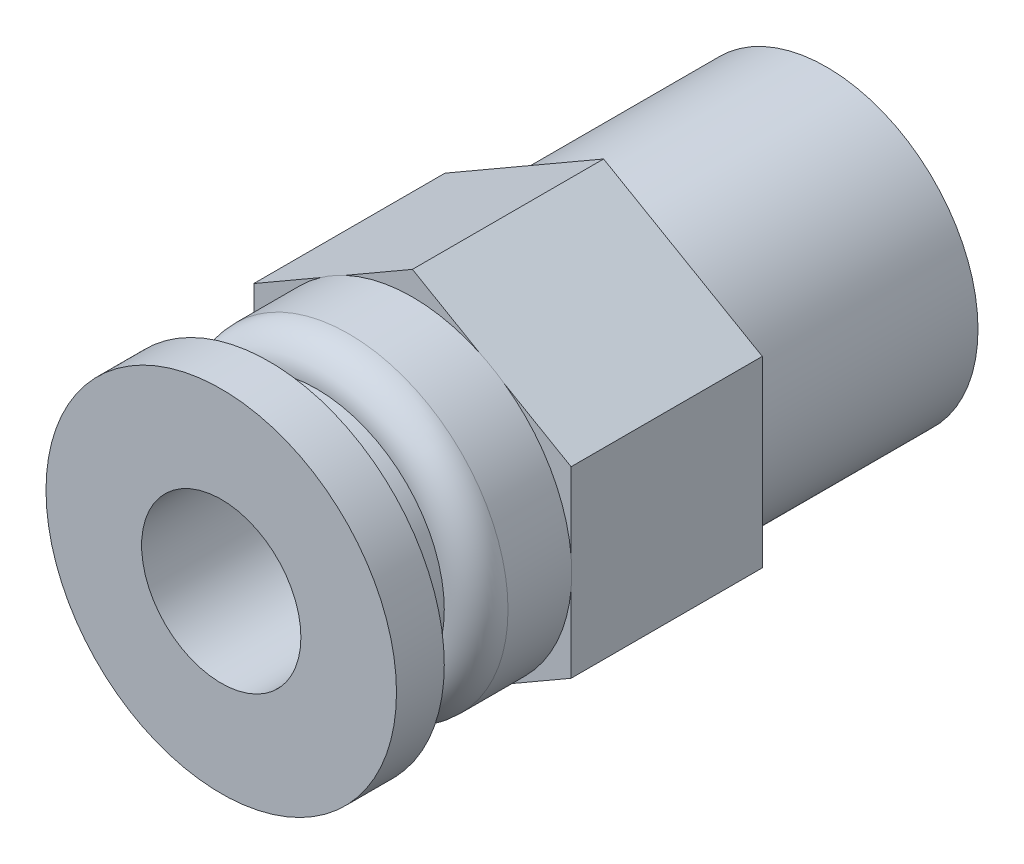
ISO-10303-21;
HEADER;
FILE_DESCRIPTION(('STEP AP214'),'2;1');
FILE_NAME('part.step','',(''),(''),'','','');
FILE_SCHEMA(('AUTOMOTIVE_DESIGN { 1 0 10303 214 1 1 1 1 }'));
ENDSEC;
DATA;
#1=APPLICATION_CONTEXT('core data for automotive mechanical design processes');
#2=APPLICATION_PROTOCOL_DEFINITION('international standard','automotive_design',2000,#1);
#3=PRODUCT_CONTEXT('',#1,'mechanical');
#4=PRODUCT('Part','Part','',(#3));
#5=PRODUCT_RELATED_PRODUCT_CATEGORY('part','',(#4));
#6=PRODUCT_DEFINITION_FORMATION('','',#4);
#7=PRODUCT_DEFINITION_CONTEXT('part definition',#1,'design');
#8=PRODUCT_DEFINITION('design','',#6,#7);
#9=PRODUCT_DEFINITION_SHAPE('','',#8);
#10=(LENGTH_UNIT() NAMED_UNIT(*) SI_UNIT(.MILLI.,.METRE.));
#11=(NAMED_UNIT(*) PLANE_ANGLE_UNIT() SI_UNIT($,.RADIAN.));
#12=(NAMED_UNIT(*) SI_UNIT($,.STERADIAN.) SOLID_ANGLE_UNIT());
#13=UNCERTAINTY_MEASURE_WITH_UNIT(LENGTH_MEASURE(1.E-05),#10,'distance_accuracy_value','');
#14=(GEOMETRIC_REPRESENTATION_CONTEXT(3) GLOBAL_UNCERTAINTY_ASSIGNED_CONTEXT((#13)) GLOBAL_UNIT_ASSIGNED_CONTEXT((#10,
#11,#12)) REPRESENTATION_CONTEXT('',''));
#15=CARTESIAN_POINT('',(0.,0.,0.));
#16=DIRECTION('',(0.,0.,1.));
#17=DIRECTION('',(1.,0.,0.));
#18=AXIS2_PLACEMENT_3D('',#15,#16,#17);
#19=CARTESIAN_POINT('',(0.,0.,7.));
#20=DIRECTION('',(0.,0.,1.));
#21=DIRECTION('',(1.,0.,0.));
#22=AXIS2_PLACEMENT_3D('',#19,#20,#21);
#23=PLANE('',#22);
#24=DIRECTION('',(-0.866025403784439,0.5,0.));
#25=VECTOR('',#24,1.);
#26=CARTESIAN_POINT('',(1.29903810567666,0.750000000000001,7.));
#27=LINE('',#26,#25);
#28=CARTESIAN_POINT('',(1.29903810567666,0.750000000000001,7.));
#29=VERTEX_POINT('',#28);
#30=CARTESIAN_POINT('',(0.,1.5,7.));
#31=VERTEX_POINT('',#30);
#32=EDGE_CURVE('E307',#29,#31,#27,.T.);
#33=ORIENTED_EDGE('',*,*,#32,.F.);
#34=CARTESIAN_POINT('',(0.,0.,7.));
#35=DIRECTION('',(0.,0.,1.));
#36=DIRECTION('',(1.,0.,0.));
#37=AXIS2_PLACEMENT_3D('',#34,#35,#36);
#38=CIRCLE('',#37,1.5);
#39=EDGE_CURVE('E48',#29,#31,#38,.T.);
#40=ORIENTED_EDGE('',*,*,#39,.T.);
#41=EDGE_LOOP('',(#33,#40));
#42=FACE_BOUND('',#41,.T.);
#43=ADVANCED_FACE('F39',(#42),#23,.T.);
#44=DIRECTION('',(-0.866025403784439,-0.5,0.));
#45=VECTOR('',#44,1.);
#46=CARTESIAN_POINT('',(0.,1.5,7.));
#47=LINE('',#46,#45);
#48=CARTESIAN_POINT('',(-1.29903810567666,0.75,7.));
#49=VERTEX_POINT('',#48);
#50=EDGE_CURVE('E311',#31,#49,#47,.T.);
#51=ORIENTED_EDGE('',*,*,#50,.F.);
#52=CARTESIAN_POINT('',(0.,0.,7.));
#53=DIRECTION('',(0.,0.,1.));
#54=DIRECTION('',(1.,0.,0.));
#55=AXIS2_PLACEMENT_3D('',#52,#53,#54);
#56=CIRCLE('',#55,1.5);
#57=EDGE_CURVE('E392',#31,#49,#56,.T.);
#58=ORIENTED_EDGE('',*,*,#57,.T.);
#59=EDGE_LOOP('',(#51,#58));
#60=FACE_BOUND('',#59,.T.);
#61=ADVANCED_FACE('F410',(#60),#23,.T.);
#62=DIRECTION('',(0.,-1.,0.));
#63=VECTOR('',#62,1.);
#64=CARTESIAN_POINT('',(-1.29903810567666,0.75,7.));
#65=LINE('',#64,#63);
#66=CARTESIAN_POINT('',(-1.29903810567666,-0.750000000000001,7.));
#67=VERTEX_POINT('',#66);
#68=EDGE_CURVE('E316',#49,#67,#65,.T.);
#69=ORIENTED_EDGE('',*,*,#68,.F.);
#70=CARTESIAN_POINT('',(0.,0.,7.));
#71=DIRECTION('',(0.,0.,1.));
#72=DIRECTION('',(1.,0.,0.));
#73=AXIS2_PLACEMENT_3D('',#70,#71,#72);
#74=CIRCLE('',#73,1.5);
#75=EDGE_CURVE('E389',#49,#67,#74,.T.);
#76=ORIENTED_EDGE('',*,*,#75,.T.);
#77=EDGE_LOOP('',(#69,#76));
#78=FACE_BOUND('',#77,.T.);
#79=ADVANCED_FACE('F416',(#78),#23,.T.);
#80=DIRECTION('',(0.866025403784439,-0.5,0.));
#81=VECTOR('',#80,1.);
#82=CARTESIAN_POINT('',(-1.29903810567666,-0.750000000000001,7.));
#83=LINE('',#82,#81);
#84=CARTESIAN_POINT('',(0.,-1.5,7.));
#85=VERTEX_POINT('',#84);
#86=EDGE_CURVE('E320',#67,#85,#83,.T.);
#87=ORIENTED_EDGE('',*,*,#86,.F.);
#88=CARTESIAN_POINT('',(0.,0.,7.));
#89=DIRECTION('',(0.,0.,1.));
#90=DIRECTION('',(1.,0.,0.));
#91=AXIS2_PLACEMENT_3D('',#88,#89,#90);
#92=CIRCLE('',#91,1.5);
#93=EDGE_CURVE('E386',#67,#85,#92,.T.);
#94=ORIENTED_EDGE('',*,*,#93,.T.);
#95=EDGE_LOOP('',(#87,#94));
#96=FACE_BOUND('',#95,.T.);
#97=ADVANCED_FACE('F427',(#96),#23,.T.);
#98=DIRECTION('',(0.866025403784439,0.5,0.));
#99=VECTOR('',#98,1.);
#100=CARTESIAN_POINT('',(0.,-1.5,7.));
#101=LINE('',#100,#99);
#102=CARTESIAN_POINT('',(1.29903810567666,-0.75,7.));
#103=VERTEX_POINT('',#102);
#104=EDGE_CURVE('E324',#85,#103,#101,.T.);
#105=ORIENTED_EDGE('',*,*,#104,.F.);
#106=CARTESIAN_POINT('',(0.,0.,7.));
#107=DIRECTION('',(0.,0.,1.));
#108=DIRECTION('',(1.,0.,0.));
#109=AXIS2_PLACEMENT_3D('',#106,#107,#108);
#110=CIRCLE('',#109,1.5);
#111=EDGE_CURVE('E383',#85,#103,#110,.T.);
#112=ORIENTED_EDGE('',*,*,#111,.T.);
#113=EDGE_LOOP('',(#105,#112));
#114=FACE_BOUND('',#113,.T.);
#115=ADVANCED_FACE('F429',(#114),#23,.T.);
#116=CARTESIAN_POINT('',(0.,0.,13.));
#117=DIRECTION('',(0.,0.,1.));
#118=DIRECTION('',(1.,0.,0.));
#119=AXIS2_PLACEMENT_3D('',#116,#117,#118);
#120=PLANE('',#119);
#121=CARTESIAN_POINT('',(0.,0.,13.));
#122=DIRECTION('',(0.,0.,1.));
#123=DIRECTION('',(1.,0.,0.));
#124=AXIS2_PLACEMENT_3D('',#121,#122,#123);
#125=CIRCLE('',#124,5.);
#126=CARTESIAN_POINT('',(4.97964607176052,0.450693909433034,13.));
#127=VERTEX_POINT('',#126);
#128=CARTESIAN_POINT('',(2.88013541078014,4.08715304528352,13.));
#129=VERTEX_POINT('',#128);
#130=EDGE_CURVE('E55',#127,#129,#125,.T.);
#131=ORIENTED_EDGE('',*,*,#130,.F.);
#132=DIRECTION('',(0.,1.,0.));
#133=VECTOR('',#132,1.);
#134=CARTESIAN_POINT('',(4.97964607176052,-2.875,13.));
#135=LINE('',#134,#133);
#136=CARTESIAN_POINT('',(4.97964607176052,2.875,13.));
#137=VERTEX_POINT('',#136);
#138=EDGE_CURVE('E175',#127,#137,#135,.T.);
#139=ORIENTED_EDGE('',*,*,#138,.T.);
#140=DIRECTION('',(-0.866025403784439,0.5,0.));
#141=VECTOR('',#140,1.);
#142=CARTESIAN_POINT('',(4.97964607176052,2.875,13.));
#143=LINE('',#142,#141);
#144=EDGE_CURVE('E565',#137,#129,#143,.T.);
#145=ORIENTED_EDGE('',*,*,#144,.T.);
#146=EDGE_LOOP('',(#131,#139,#145));
#147=FACE_BOUND('',#146,.T.);
#148=ADVANCED_FACE('F435',(#147),#120,.T.);
#149=CARTESIAN_POINT('',(2.09951066098038,4.53784695471649,13.));
#150=VERTEX_POINT('',#149);
#151=CARTESIAN_POINT('',(-2.09951066098038,4.53784695471649,13.));
#152=VERTEX_POINT('',#151);
#153=EDGE_CURVE('E215',#150,#152,#125,.T.);
#154=ORIENTED_EDGE('',*,*,#153,.F.);
#155=CARTESIAN_POINT('',(0.,5.75,13.));
#156=VERTEX_POINT('',#155);
#157=EDGE_CURVE('E285',#150,#156,#143,.T.);
#158=ORIENTED_EDGE('',*,*,#157,.T.);
#159=DIRECTION('',(-0.866025403784439,-0.5,0.));
#160=VECTOR('',#159,1.);
#161=CARTESIAN_POINT('',(0.,5.75,13.));
#162=LINE('',#161,#160);
#163=EDGE_CURVE('E253',#156,#152,#162,.T.);
#164=ORIENTED_EDGE('',*,*,#163,.T.);
#165=EDGE_LOOP('',(#154,#158,#164));
#166=FACE_BOUND('',#165,.T.);
#167=ADVANCED_FACE('F572',(#166),#120,.T.);
#168=CARTESIAN_POINT('',(-2.88013541078015,4.08715304528351,13.));
#169=VERTEX_POINT('',#168);
#170=CARTESIAN_POINT('',(-4.97964607176052,0.450693909432992,13.));
#171=VERTEX_POINT('',#170);
#172=EDGE_CURVE('E223',#169,#171,#125,.T.);
#173=ORIENTED_EDGE('',*,*,#172,.F.);
#174=CARTESIAN_POINT('',(-4.97964607176052,2.875,13.));
#175=VERTEX_POINT('',#174);
#176=EDGE_CURVE('E562',#169,#175,#162,.T.);
#177=ORIENTED_EDGE('',*,*,#176,.T.);
#178=DIRECTION('',(0.,-1.,0.));
#179=VECTOR('',#178,1.);
#180=CARTESIAN_POINT('',(-4.97964607176052,2.875,13.));
#181=LINE('',#180,#179);
#182=EDGE_CURVE('E255',#175,#171,#181,.T.);
#183=ORIENTED_EDGE('',*,*,#182,.T.);
#184=EDGE_LOOP('',(#173,#177,#183));
#185=FACE_BOUND('',#184,.T.);
#186=ADVANCED_FACE('F818',(#185),#120,.T.);
#187=CARTESIAN_POINT('',(-4.97964607176052,-0.450693909432997,13.));
#188=VERTEX_POINT('',#187);
#189=CARTESIAN_POINT('',(-2.88013541078016,-4.0871530452835,13.));
#190=VERTEX_POINT('',#189);
#191=EDGE_CURVE('E199',#188,#190,#125,.T.);
#192=ORIENTED_EDGE('',*,*,#191,.F.);
#193=CARTESIAN_POINT('',(-4.97964607176052,-2.875,13.));
#194=VERTEX_POINT('',#193);
#195=EDGE_CURVE('E240',#188,#194,#181,.T.);
#196=ORIENTED_EDGE('',*,*,#195,.T.);
#197=DIRECTION('',(0.866025403784439,-0.5,0.));
#198=VECTOR('',#197,1.);
#199=CARTESIAN_POINT('',(-4.97964607176052,-2.875,13.));
#200=LINE('',#199,#198);
#201=EDGE_CURVE('E243',#194,#190,#200,.T.);
#202=ORIENTED_EDGE('',*,*,#201,.T.);
#203=EDGE_LOOP('',(#192,#196,#202));
#204=FACE_BOUND('',#203,.T.);
#205=ADVANCED_FACE('F239',(#204),#120,.T.);
#206=CARTESIAN_POINT('',(-2.09951066098036,-4.5378469547165,13.));
#207=VERTEX_POINT('',#206);
#208=CARTESIAN_POINT('',(2.09951066098037,-4.5378469547165,13.));
#209=VERTEX_POINT('',#208);
#210=EDGE_CURVE('E195',#207,#209,#125,.T.);
#211=ORIENTED_EDGE('',*,*,#210,.F.);
#212=CARTESIAN_POINT('',(0.,-5.75,13.));
#213=VERTEX_POINT('',#212);
#214=EDGE_CURVE('E260',#207,#213,#200,.T.);
#215=ORIENTED_EDGE('',*,*,#214,.T.);
#216=DIRECTION('',(0.866025403784439,0.5,0.));
#217=VECTOR('',#216,1.);
#218=CARTESIAN_POINT('',(0.,-5.75,13.));
#219=LINE('',#218,#217);
#220=EDGE_CURVE('E266',#213,#209,#219,.T.);
#221=ORIENTED_EDGE('',*,*,#220,.T.);
#222=EDGE_LOOP('',(#211,#215,#221));
#223=FACE_BOUND('',#222,.T.);
#224=ADVANCED_FACE('F446',(#223),#120,.T.);
#225=DIRECTION('',(0.,1.,0.));
#226=VECTOR('',#225,1.);
#227=CARTESIAN_POINT('',(1.29903810567666,-0.75,7.));
#228=LINE('',#227,#226);
#229=EDGE_CURVE('E328',#103,#29,#228,.T.);
#230=ORIENTED_EDGE('',*,*,#229,.F.);
#231=CARTESIAN_POINT('',(0.,0.,7.));
#232=DIRECTION('',(0.,0.,1.));
#233=DIRECTION('',(1.,0.,0.));
#234=AXIS2_PLACEMENT_3D('',#231,#232,#233);
#235=CIRCLE('',#234,1.5);
#236=EDGE_CURVE('E380',#103,#29,#235,.T.);
#237=ORIENTED_EDGE('',*,*,#236,.T.);
#238=EDGE_LOOP('',(#230,#237));
#239=FACE_BOUND('',#238,.T.);
#240=ADVANCED_FACE('F437',(#239),#23,.T.);
#241=CARTESIAN_POINT('',(0.,0.,0.));
#242=DIRECTION('',(0.,0.,1.));
#243=DIRECTION('',(1.,0.,0.));
#244=AXIS2_PLACEMENT_3D('',#241,#242,#243);
#245=PLANE('',#244);
#246=CARTESIAN_POINT('',(0.,0.,0.));
#247=DIRECTION('',(0.,0.,1.));
#248=DIRECTION('',(1.,0.,0.));
#249=AXIS2_PLACEMENT_3D('',#246,#247,#248);
#250=CIRCLE('',#249,4.75);
#251=CARTESIAN_POINT('',(4.75,0.,0.));
#252=VERTEX_POINT('',#251);
#253=EDGE_CURVE('E201',#252,#252,#250,.T.);
#254=ORIENTED_EDGE('',*,*,#253,.F.);
#255=EDGE_LOOP('',(#254));
#256=FACE_BOUND('',#255,.T.);
#257=DIRECTION('',(-0.866025403784439,0.5,0.));
#258=VECTOR('',#257,1.);
#259=CARTESIAN_POINT('',(1.29903810567666,0.750000000000001,0.));
#260=LINE('',#259,#258);
#261=CARTESIAN_POINT('',(1.29903810567666,0.750000000000001,0.));
#262=VERTEX_POINT('',#261);
#263=CARTESIAN_POINT('',(0.,1.5,0.));
#264=VERTEX_POINT('',#263);
#265=EDGE_CURVE('E306',#262,#264,#260,.T.);
#266=ORIENTED_EDGE('',*,*,#265,.T.);
#267=DIRECTION('',(-0.866025403784439,-0.5,0.));
#268=VECTOR('',#267,1.);
#269=CARTESIAN_POINT('',(0.,1.5,0.));
#270=LINE('',#269,#268);
#271=CARTESIAN_POINT('',(-1.29903810567666,0.75,0.));
#272=VERTEX_POINT('',#271);
#273=EDGE_CURVE('E336',#264,#272,#270,.T.);
#274=ORIENTED_EDGE('',*,*,#273,.T.);
#275=DIRECTION('',(0.,-1.,0.));
#276=VECTOR('',#275,1.);
#277=CARTESIAN_POINT('',(-1.29903810567666,0.75,0.));
#278=LINE('',#277,#276);
#279=CARTESIAN_POINT('',(-1.29903810567666,-0.750000000000001,0.));
#280=VERTEX_POINT('',#279);
#281=EDGE_CURVE('E340',#272,#280,#278,.T.);
#282=ORIENTED_EDGE('',*,*,#281,.T.);
#283=DIRECTION('',(0.866025403784439,-0.5,0.));
#284=VECTOR('',#283,1.);
#285=CARTESIAN_POINT('',(-1.29903810567666,-0.750000000000001,0.));
#286=LINE('',#285,#284);
#287=CARTESIAN_POINT('',(0.,-1.5,0.));
#288=VERTEX_POINT('',#287);
#289=EDGE_CURVE('E344',#280,#288,#286,.T.);
#290=ORIENTED_EDGE('',*,*,#289,.T.);
#291=DIRECTION('',(0.866025403784439,0.5,0.));
#292=VECTOR('',#291,1.);
#293=CARTESIAN_POINT('',(0.,-1.5,0.));
#294=LINE('',#293,#292);
#295=CARTESIAN_POINT('',(1.29903810567666,-0.75,0.));
#296=VERTEX_POINT('',#295);
#297=EDGE_CURVE('E348',#288,#296,#294,.T.);
#298=ORIENTED_EDGE('',*,*,#297,.T.);
#299=DIRECTION('',(0.,1.,0.));
#300=VECTOR('',#299,1.);
#301=CARTESIAN_POINT('',(1.29903810567666,-0.75,0.));
#302=LINE('',#301,#300);
#303=EDGE_CURVE('E312',#296,#262,#302,.T.);
#304=ORIENTED_EDGE('',*,*,#303,.T.);
#305=EDGE_LOOP('',(#266,#274,#282,#290,#298,#304));
#306=FACE_BOUND('',#305,.T.);
#307=ADVANCED_FACE('F445',(#256,#306),#245,.F.);
#308=CARTESIAN_POINT('',(0.,0.,7.));
#309=DIRECTION('',(0.,0.,-1.));
#310=DIRECTION('',(-1.,0.,0.));
#311=AXIS2_PLACEMENT_3D('',#308,#309,#310);
#312=CYLINDRICAL_SURFACE('',#311,4.75);
#313=CARTESIAN_POINT('',(0.,0.,7.));
#314=DIRECTION('',(0.,0.,1.));
#315=DIRECTION('',(1.,0.,0.));
#316=AXIS2_PLACEMENT_3D('',#313,#314,#315);
#317=CIRCLE('',#316,4.75);
#318=CARTESIAN_POINT('',(4.75,0.,7.));
#319=VERTEX_POINT('',#318);
#320=EDGE_CURVE('E196',#319,#319,#317,.T.);
#321=ORIENTED_EDGE('',*,*,#320,.F.);
#322=EDGE_LOOP('',(#321));
#323=FACE_BOUND('',#322,.T.);
#324=ORIENTED_EDGE('',*,*,#253,.T.);
#325=EDGE_LOOP('',(#324));
#326=FACE_BOUND('',#325,.T.);
#327=ADVANCED_FACE('F452',(#323,#326),#312,.T.);
#328=CARTESIAN_POINT('',(1.29903810567666,0.750000000000001,7.));
#329=DIRECTION('',(-0.5,-0.866025403784439,0.));
#330=DIRECTION('',(0.866025403784439,-0.5,0.));
#331=AXIS2_PLACEMENT_3D('',#328,#329,#330);
#332=PLANE('',#331);
#333=ORIENTED_EDGE('',*,*,#265,.F.);
#334=DIRECTION('',(0.,0.,-1.));
#335=VECTOR('',#334,1.);
#336=CARTESIAN_POINT('',(1.29903810567666,0.750000000000001,7.));
#337=LINE('',#336,#335);
#338=EDGE_CURVE('E332',#29,#262,#337,.T.);
#339=ORIENTED_EDGE('',*,*,#338,.F.);
#340=ORIENTED_EDGE('',*,*,#32,.T.);
#341=DIRECTION('',(0.,0.,-1.));
#342=VECTOR('',#341,1.);
#343=CARTESIAN_POINT('',(0.,1.5,7.));
#344=LINE('',#343,#342);
#345=EDGE_CURVE('E370',#31,#264,#344,.T.);
#346=ORIENTED_EDGE('',*,*,#345,.T.);
#347=EDGE_LOOP('',(#333,#339,#340,#346));
#348=FACE_BOUND('',#347,.T.);
#349=ADVANCED_FACE('F404',(#348),#332,.T.);
#350=CARTESIAN_POINT('',(0.,1.5,7.));
#351=DIRECTION('',(0.5,-0.866025403784439,0.));
#352=DIRECTION('',(0.866025403784439,0.5,0.));
#353=AXIS2_PLACEMENT_3D('',#350,#351,#352);
#354=PLANE('',#353);
#355=ORIENTED_EDGE('',*,*,#273,.F.);
#356=ORIENTED_EDGE('',*,*,#345,.F.);
#357=ORIENTED_EDGE('',*,*,#50,.T.);
#358=DIRECTION('',(0.,0.,-1.));
#359=VECTOR('',#358,1.);
#360=CARTESIAN_POINT('',(-1.29903810567666,0.75,7.));
#361=LINE('',#360,#359);
#362=EDGE_CURVE('E367',#49,#272,#361,.T.);
#363=ORIENTED_EDGE('',*,*,#362,.T.);
#364=EDGE_LOOP('',(#355,#356,#357,#363));
#365=FACE_BOUND('',#364,.T.);
#366=ADVANCED_FACE('F407',(#365),#354,.T.);
#367=CARTESIAN_POINT('',(-1.29903810567666,0.75,7.));
#368=DIRECTION('',(1.,0.,0.));
#369=DIRECTION('',(0.,1.,0.));
#370=AXIS2_PLACEMENT_3D('',#367,#368,#369);
#371=PLANE('',#370);
#372=ORIENTED_EDGE('',*,*,#281,.F.);
#373=ORIENTED_EDGE('',*,*,#362,.F.);
#374=ORIENTED_EDGE('',*,*,#68,.T.);
#375=DIRECTION('',(0.,0.,-1.));
#376=VECTOR('',#375,1.);
#377=CARTESIAN_POINT('',(-1.29903810567666,-0.750000000000001,7.));
#378=LINE('',#377,#376);
#379=EDGE_CURVE('E364',#67,#280,#378,.T.);
#380=ORIENTED_EDGE('',*,*,#379,.T.);
#381=EDGE_LOOP('',(#372,#373,#374,#380));
#382=FACE_BOUND('',#381,.T.);
#383=ADVANCED_FACE('F420',(#382),#371,.T.);
#384=CARTESIAN_POINT('',(-1.29903810567666,-0.750000000000001,7.));
#385=DIRECTION('',(0.5,0.866025403784439,0.));
#386=DIRECTION('',(-0.866025403784439,0.5,0.));
#387=AXIS2_PLACEMENT_3D('',#384,#385,#386);
#388=PLANE('',#387);
#389=ORIENTED_EDGE('',*,*,#289,.F.);
#390=ORIENTED_EDGE('',*,*,#379,.F.);
#391=ORIENTED_EDGE('',*,*,#86,.T.);
#392=DIRECTION('',(0.,0.,-1.));
#393=VECTOR('',#392,1.);
#394=CARTESIAN_POINT('',(0.,-1.5,7.));
#395=LINE('',#394,#393);
#396=EDGE_CURVE('E361',#85,#288,#395,.T.);
#397=ORIENTED_EDGE('',*,*,#396,.T.);
#398=EDGE_LOOP('',(#389,#390,#391,#397));
#399=FACE_BOUND('',#398,.T.);
#400=ADVANCED_FACE('F424',(#399),#388,.T.);
#401=CARTESIAN_POINT('',(0.,-1.5,7.));
#402=DIRECTION('',(-0.5,0.866025403784439,0.));
#403=DIRECTION('',(-0.866025403784439,-0.5,0.));
#404=AXIS2_PLACEMENT_3D('',#401,#402,#403);
#405=PLANE('',#404);
#406=ORIENTED_EDGE('',*,*,#297,.F.);
#407=ORIENTED_EDGE('',*,*,#396,.F.);
#408=ORIENTED_EDGE('',*,*,#104,.T.);
#409=DIRECTION('',(0.,0.,-1.));
#410=VECTOR('',#409,1.);
#411=CARTESIAN_POINT('',(1.29903810567666,-0.75,7.));
#412=LINE('',#411,#410);
#413=EDGE_CURVE('E358',#103,#296,#412,.T.);
#414=ORIENTED_EDGE('',*,*,#413,.T.);
#415=EDGE_LOOP('',(#406,#407,#408,#414));
#416=FACE_BOUND('',#415,.T.);
#417=ADVANCED_FACE('F464',(#416),#405,.T.);
#418=CARTESIAN_POINT('',(1.29903810567666,-0.75,7.));
#419=DIRECTION('',(-1.,0.,0.));
#420=DIRECTION('',(0.,-1.,0.));
#421=AXIS2_PLACEMENT_3D('',#418,#419,#420);
#422=PLANE('',#421);
#423=ORIENTED_EDGE('',*,*,#303,.F.);
#424=ORIENTED_EDGE('',*,*,#413,.F.);
#425=ORIENTED_EDGE('',*,*,#229,.T.);
#426=ORIENTED_EDGE('',*,*,#338,.T.);
#427=EDGE_LOOP('',(#423,#424,#425,#426));
#428=FACE_BOUND('',#427,.T.);
#429=ADVANCED_FACE('F461',(#428),#422,.T.);
#430=CARTESIAN_POINT('',(0.,0.,7.));
#431=DIRECTION('',(0.,0.,1.));
#432=DIRECTION('',(1.,0.,0.));
#433=AXIS2_PLACEMENT_3D('',#430,#431,#432);
#434=PLANE('',#433);
#435=DIRECTION('',(-0.866025403784439,0.5,0.));
#436=VECTOR('',#435,1.);
#437=CARTESIAN_POINT('',(4.97964607176052,2.875,7.));
#438=LINE('',#437,#436);
#439=CARTESIAN_POINT('',(4.97964607176052,2.875,7.));
#440=VERTEX_POINT('',#439);
#441=CARTESIAN_POINT('',(0.,5.75,7.));
#442=VERTEX_POINT('',#441);
#443=EDGE_CURVE('E206',#440,#442,#438,.T.);
#444=ORIENTED_EDGE('',*,*,#443,.F.);
#445=DIRECTION('',(0.,1.,0.));
#446=VECTOR('',#445,1.);
#447=CARTESIAN_POINT('',(4.97964607176052,-2.875,7.));
#448=LINE('',#447,#446);
#449=CARTESIAN_POINT('',(4.97964607176052,-2.875,7.));
#450=VERTEX_POINT('',#449);
#451=EDGE_CURVE('E282',#450,#440,#448,.T.);
#452=ORIENTED_EDGE('',*,*,#451,.F.);
#453=DIRECTION('',(0.866025403784439,0.5,0.));
#454=VECTOR('',#453,1.);
#455=CARTESIAN_POINT('',(0.,-5.75,7.));
#456=LINE('',#455,#454);
#457=CARTESIAN_POINT('',(0.,-5.75,7.));
#458=VERTEX_POINT('',#457);
#459=EDGE_CURVE('E279',#458,#450,#456,.T.);
#460=ORIENTED_EDGE('',*,*,#459,.F.);
#461=DIRECTION('',(0.866025403784439,-0.5,0.));
#462=VECTOR('',#461,1.);
#463=CARTESIAN_POINT('',(-4.97964607176052,-2.875,7.));
#464=LINE('',#463,#462);
#465=CARTESIAN_POINT('',(-4.97964607176052,-2.875,7.));
#466=VERTEX_POINT('',#465);
#467=EDGE_CURVE('E276',#466,#458,#464,.T.);
#468=ORIENTED_EDGE('',*,*,#467,.F.);
#469=DIRECTION('',(0.,-1.,0.));
#470=VECTOR('',#469,1.);
#471=CARTESIAN_POINT('',(-4.97964607176052,2.875,7.));
#472=LINE('',#471,#470);
#473=CARTESIAN_POINT('',(-4.97964607176052,2.875,7.));
#474=VERTEX_POINT('',#473);
#475=EDGE_CURVE('E273',#474,#466,#472,.T.);
#476=ORIENTED_EDGE('',*,*,#475,.F.);
#477=DIRECTION('',(-0.866025403784439,-0.5,0.));
#478=VECTOR('',#477,1.);
#479=CARTESIAN_POINT('',(0.,5.75,7.));
#480=LINE('',#479,#478);
#481=EDGE_CURVE('E212',#442,#474,#480,.T.);
#482=ORIENTED_EDGE('',*,*,#481,.F.);
#483=EDGE_LOOP('',(#444,#452,#460,#468,#476,#482));
#484=FACE_BOUND('',#483,.T.);
#485=ORIENTED_EDGE('',*,*,#320,.T.);
#486=EDGE_LOOP('',(#485));
#487=FACE_BOUND('',#486,.T.);
#488=ADVANCED_FACE('F472',(#484,#487),#434,.F.);
#489=CARTESIAN_POINT('',(2.88013541078016,-4.0871530452835,13.));
#490=VERTEX_POINT('',#489);
#491=CARTESIAN_POINT('',(4.97964607176052,-0.450693909433031,13.));
#492=VERTEX_POINT('',#491);
#493=EDGE_CURVE('E63',#490,#492,#125,.T.);
#494=ORIENTED_EDGE('',*,*,#493,.F.);
#495=CARTESIAN_POINT('',(4.97964607176052,-2.875,13.));
#496=VERTEX_POINT('',#495);
#497=EDGE_CURVE('E167',#490,#496,#219,.T.);
#498=ORIENTED_EDGE('',*,*,#497,.T.);
#499=EDGE_CURVE('E164',#496,#492,#135,.T.);
#500=ORIENTED_EDGE('',*,*,#499,.T.);
#501=EDGE_LOOP('',(#494,#498,#500));
#502=FACE_BOUND('',#501,.T.);
#503=ADVANCED_FACE('F166',(#502),#120,.T.);
#504=CARTESIAN_POINT('',(4.97964607176052,2.875,13.));
#505=DIRECTION('',(-0.5,-0.866025403784439,0.));
#506=DIRECTION('',(0.866025403784439,-0.5,0.));
#507=AXIS2_PLACEMENT_3D('',#504,#505,#506);
#508=PLANE('',#507);
#509=ORIENTED_EDGE('',*,*,#443,.T.);
#510=DIRECTION('',(0.,0.,-1.));
#511=VECTOR('',#510,1.);
#512=CARTESIAN_POINT('',(0.,5.75,13.));
#513=LINE('',#512,#511);
#514=EDGE_CURVE('E302',#156,#442,#513,.T.);
#515=ORIENTED_EDGE('',*,*,#514,.F.);
#516=ORIENTED_EDGE('',*,*,#157,.F.);
#517=EDGE_CURVE('E568',#129,#150,#143,.T.);
#518=ORIENTED_EDGE('',*,*,#517,.F.);
#519=ORIENTED_EDGE('',*,*,#144,.F.);
#520=DIRECTION('',(0.,0.,-1.));
#521=VECTOR('',#520,1.);
#522=CARTESIAN_POINT('',(4.97964607176052,2.875,13.));
#523=LINE('',#522,#521);
#524=EDGE_CURVE('E172',#137,#440,#523,.T.);
#525=ORIENTED_EDGE('',*,*,#524,.T.);
#526=EDGE_LOOP('',(#509,#515,#516,#518,#519,#525));
#527=FACE_BOUND('',#526,.T.);
#528=ADVANCED_FACE('F521',(#527),#508,.F.);
#529=CARTESIAN_POINT('',(0.,5.75,13.));
#530=DIRECTION('',(0.5,-0.866025403784438,0.));
#531=DIRECTION('',(0.866025403784439,0.5,0.));
#532=AXIS2_PLACEMENT_3D('',#529,#530,#531);
#533=PLANE('',#532);
#534=ORIENTED_EDGE('',*,*,#481,.T.);
#535=DIRECTION('',(0.,0.,-1.));
#536=VECTOR('',#535,1.);
#537=CARTESIAN_POINT('',(-4.97964607176052,2.875,13.));
#538=LINE('',#537,#536);
#539=EDGE_CURVE('E298',#175,#474,#538,.T.);
#540=ORIENTED_EDGE('',*,*,#539,.F.);
#541=ORIENTED_EDGE('',*,*,#176,.F.);
#542=EDGE_CURVE('E558',#152,#169,#162,.T.);
#543=ORIENTED_EDGE('',*,*,#542,.F.);
#544=ORIENTED_EDGE('',*,*,#163,.F.);
#545=ORIENTED_EDGE('',*,*,#514,.T.);
#546=EDGE_LOOP('',(#534,#540,#541,#543,#544,#545));
#547=FACE_BOUND('',#546,.T.);
#548=ADVANCED_FACE('F537',(#547),#533,.F.);
#549=CARTESIAN_POINT('',(-4.97964607176052,2.875,13.));
#550=DIRECTION('',(1.,0.,0.));
#551=DIRECTION('',(0.,1.,0.));
#552=AXIS2_PLACEMENT_3D('',#549,#550,#551);
#553=PLANE('',#552);
#554=ORIENTED_EDGE('',*,*,#475,.T.);
#555=DIRECTION('',(0.,0.,-1.));
#556=VECTOR('',#555,1.);
#557=CARTESIAN_POINT('',(-4.97964607176052,-2.875,13.));
#558=LINE('',#557,#556);
#559=EDGE_CURVE('E251',#194,#466,#558,.T.);
#560=ORIENTED_EDGE('',*,*,#559,.F.);
#561=ORIENTED_EDGE('',*,*,#195,.F.);
#562=EDGE_CURVE('E248',#171,#188,#181,.T.);
#563=ORIENTED_EDGE('',*,*,#562,.F.);
#564=ORIENTED_EDGE('',*,*,#182,.F.);
#565=ORIENTED_EDGE('',*,*,#539,.T.);
#566=EDGE_LOOP('',(#554,#560,#561,#563,#564,#565));
#567=FACE_BOUND('',#566,.T.);
#568=ADVANCED_FACE('F246',(#567),#553,.F.);
#569=CARTESIAN_POINT('',(-4.97964607176052,-2.875,13.));
#570=DIRECTION('',(0.5,0.866025403784439,0.));
#571=DIRECTION('',(-0.866025403784439,0.5,0.));
#572=AXIS2_PLACEMENT_3D('',#569,#570,#571);
#573=PLANE('',#572);
#574=ORIENTED_EDGE('',*,*,#467,.T.);
#575=DIRECTION('',(0.,0.,-1.));
#576=VECTOR('',#575,1.);
#577=CARTESIAN_POINT('',(0.,-5.75,13.));
#578=LINE('',#577,#576);
#579=EDGE_CURVE('E292',#213,#458,#578,.T.);
#580=ORIENTED_EDGE('',*,*,#579,.F.);
#581=ORIENTED_EDGE('',*,*,#214,.F.);
#582=EDGE_CURVE('E265',#190,#207,#200,.T.);
#583=ORIENTED_EDGE('',*,*,#582,.F.);
#584=ORIENTED_EDGE('',*,*,#201,.F.);
#585=ORIENTED_EDGE('',*,*,#559,.T.);
#586=EDGE_LOOP('',(#574,#580,#581,#583,#584,#585));
#587=FACE_BOUND('',#586,.T.);
#588=ADVANCED_FACE('F530',(#587),#573,.F.);
#589=CARTESIAN_POINT('',(0.,-5.75,13.));
#590=DIRECTION('',(-0.5,0.866025403784439,0.));
#591=DIRECTION('',(-0.866025403784439,-0.5,0.));
#592=AXIS2_PLACEMENT_3D('',#589,#590,#591);
#593=PLANE('',#592);
#594=ORIENTED_EDGE('',*,*,#459,.T.);
#595=DIRECTION('',(0.,0.,-1.));
#596=VECTOR('',#595,1.);
#597=CARTESIAN_POINT('',(4.97964607176052,-2.875,13.));
#598=LINE('',#597,#596);
#599=EDGE_CURVE('E289',#496,#450,#598,.T.);
#600=ORIENTED_EDGE('',*,*,#599,.F.);
#601=ORIENTED_EDGE('',*,*,#497,.F.);
#602=EDGE_CURVE('E269',#209,#490,#219,.T.);
#603=ORIENTED_EDGE('',*,*,#602,.F.);
#604=ORIENTED_EDGE('',*,*,#220,.F.);
#605=ORIENTED_EDGE('',*,*,#579,.T.);
#606=EDGE_LOOP('',(#594,#600,#601,#603,#604,#605));
#607=FACE_BOUND('',#606,.T.);
#608=ADVANCED_FACE('F527',(#607),#593,.F.);
#609=CARTESIAN_POINT('',(4.97964607176052,-2.875,13.));
#610=DIRECTION('',(-1.,0.,0.));
#611=DIRECTION('',(0.,-1.,0.));
#612=AXIS2_PLACEMENT_3D('',#609,#610,#611);
#613=PLANE('',#612);
#614=ORIENTED_EDGE('',*,*,#451,.T.);
#615=ORIENTED_EDGE('',*,*,#524,.F.);
#616=ORIENTED_EDGE('',*,*,#138,.F.);
#617=EDGE_CURVE('E173',#492,#127,#135,.T.);
#618=ORIENTED_EDGE('',*,*,#617,.F.);
#619=ORIENTED_EDGE('',*,*,#499,.F.);
#620=ORIENTED_EDGE('',*,*,#599,.T.);
#621=EDGE_LOOP('',(#614,#615,#616,#618,#619,#620));
#622=FACE_BOUND('',#621,.T.);
#623=ADVANCED_FACE('F178',(#622),#613,.F.);
#624=CARTESIAN_POINT('',(0.,0.,13.));
#625=DIRECTION('',(0.,0.,-1.));
#626=DIRECTION('',(-1.,0.,0.));
#627=AXIS2_PLACEMENT_3D('',#624,#625,#626);
#628=CYLINDRICAL_SURFACE('',#627,2.5);
#629=CARTESIAN_POINT('',(0.,0.,8.));
#630=DIRECTION('',(0.,0.,1.));
#631=DIRECTION('',(1.,0.,0.));
#632=AXIS2_PLACEMENT_3D('',#629,#630,#631);
#633=CIRCLE('',#632,2.5);
#634=CARTESIAN_POINT('',(2.5,0.,8.));
#635=VERTEX_POINT('',#634);
#636=EDGE_CURVE('E11',#635,#635,#633,.F.);
#637=ORIENTED_EDGE('',*,*,#636,.T.);
#638=EDGE_LOOP('',(#637));
#639=FACE_BOUND('',#638,.T.);
#640=CARTESIAN_POINT('',(0.,0.,19.));
#641=DIRECTION('',(0.,0.,1.));
#642=DIRECTION('',(1.,0.,0.));
#643=AXIS2_PLACEMENT_3D('',#640,#641,#642);
#644=CIRCLE('',#643,2.5);
#645=CARTESIAN_POINT('',(2.5,0.,19.));
#646=VERTEX_POINT('',#645);
#647=EDGE_CURVE('E607',#646,#646,#644,.T.);
#648=ORIENTED_EDGE('',*,*,#647,.T.);
#649=EDGE_LOOP('',(#648));
#650=FACE_BOUND('',#649,.T.);
#651=ADVANCED_FACE('F516',(#639,#650),#628,.F.);
#652=CARTESIAN_POINT('',(0.,0.,13.));
#653=DIRECTION('',(0.,0.,1.));
#654=DIRECTION('',(1.,0.,0.));
#655=AXIS2_PLACEMENT_3D('',#652,#653,#654);
#656=PLANE('',#655);
#657=EDGE_CURVE('E207',#129,#150,#125,.T.);
#658=ORIENTED_EDGE('',*,*,#657,.F.);
#659=ORIENTED_EDGE('',*,*,#517,.T.);
#660=EDGE_LOOP('',(#658,#659));
#661=FACE_BOUND('',#660,.T.);
#662=ADVANCED_FACE('F514',(#661),#656,.F.);
#663=EDGE_CURVE('E214',#152,#169,#125,.T.);
#664=ORIENTED_EDGE('',*,*,#663,.F.);
#665=ORIENTED_EDGE('',*,*,#542,.T.);
#666=EDGE_LOOP('',(#664,#665));
#667=FACE_BOUND('',#666,.T.);
#668=ADVANCED_FACE('F575',(#667),#656,.F.);
#669=EDGE_CURVE('E220',#171,#188,#125,.T.);
#670=ORIENTED_EDGE('',*,*,#669,.F.);
#671=ORIENTED_EDGE('',*,*,#562,.T.);
#672=EDGE_LOOP('',(#670,#671));
#673=FACE_BOUND('',#672,.T.);
#674=ADVANCED_FACE('F257',(#673),#656,.F.);
#675=EDGE_CURVE('E234',#190,#207,#125,.T.);
#676=ORIENTED_EDGE('',*,*,#675,.F.);
#677=ORIENTED_EDGE('',*,*,#582,.T.);
#678=EDGE_LOOP('',(#676,#677));
#679=FACE_BOUND('',#678,.T.);
#680=ADVANCED_FACE('F583',(#679),#656,.F.);
#681=EDGE_CURVE('E187',#209,#490,#125,.T.);
#682=ORIENTED_EDGE('',*,*,#681,.F.);
#683=ORIENTED_EDGE('',*,*,#602,.T.);
#684=EDGE_LOOP('',(#682,#683));
#685=FACE_BOUND('',#684,.T.);
#686=ADVANCED_FACE('F512',(#685),#656,.F.);
#687=EDGE_CURVE('E183',#492,#127,#125,.T.);
#688=ORIENTED_EDGE('',*,*,#687,.F.);
#689=ORIENTED_EDGE('',*,*,#617,.T.);
#690=EDGE_LOOP('',(#688,#689));
#691=FACE_BOUND('',#690,.T.);
#692=ADVANCED_FACE('F184',(#691),#656,.F.);
#693=CARTESIAN_POINT('',(0.,0.,16.));
#694=DIRECTION('',(0.,0.,-1.));
#695=DIRECTION('',(-1.,0.,0.));
#696=AXIS2_PLACEMENT_3D('',#693,#694,#695);
#697=CYLINDRICAL_SURFACE('',#696,5.);
#698=CARTESIAN_POINT('',(0.,0.,15.));
#699=DIRECTION('',(0.,0.,1.));
#700=DIRECTION('',(1.,0.,0.));
#701=AXIS2_PLACEMENT_3D('',#698,#699,#700);
#702=CIRCLE('',#701,5.);
#703=CARTESIAN_POINT('',(5.,0.,15.));
#704=VERTEX_POINT('',#703);
#705=EDGE_CURVE('E227',#704,#704,#702,.F.);
#706=ORIENTED_EDGE('',*,*,#705,.T.);
#707=EDGE_LOOP('',(#706));
#708=FACE_BOUND('',#707,.T.);
#709=ORIENTED_EDGE('',*,*,#130,.T.);
#710=ORIENTED_EDGE('',*,*,#657,.T.);
#711=ORIENTED_EDGE('',*,*,#153,.T.);
#712=ORIENTED_EDGE('',*,*,#663,.T.);
#713=ORIENTED_EDGE('',*,*,#172,.T.);
#714=ORIENTED_EDGE('',*,*,#669,.T.);
#715=ORIENTED_EDGE('',*,*,#191,.T.);
#716=ORIENTED_EDGE('',*,*,#675,.T.);
#717=ORIENTED_EDGE('',*,*,#210,.T.);
#718=ORIENTED_EDGE('',*,*,#681,.T.);
#719=ORIENTED_EDGE('',*,*,#493,.T.);
#720=ORIENTED_EDGE('',*,*,#687,.T.);
#721=EDGE_LOOP('',(#709,#710,#711,#712,#713,#714,#715,#716,#717,#718,#719,#720));
#722=FACE_BOUND('',#721,.T.);
#723=ADVANCED_FACE('F191',(#708,#722),#697,.T.);
#724=CARTESIAN_POINT('',(0.,0.,17.5));
#725=DIRECTION('',(0.,0.,-1.));
#726=DIRECTION('',(-1.,0.,0.));
#727=AXIS2_PLACEMENT_3D('',#724,#725,#726);
#728=CYLINDRICAL_SURFACE('',#727,4.);
#729=CARTESIAN_POINT('',(0.,0.,17.5));
#730=DIRECTION('',(0.,0.,1.));
#731=DIRECTION('',(1.,0.,0.));
#732=AXIS2_PLACEMENT_3D('',#729,#730,#731);
#733=CIRCLE('',#732,4.);
#734=CARTESIAN_POINT('',(4.,0.,17.5));
#735=VERTEX_POINT('',#734);
#736=EDGE_CURVE('E188',#735,#735,#733,.T.);
#737=ORIENTED_EDGE('',*,*,#736,.F.);
#738=EDGE_LOOP('',(#737));
#739=FACE_BOUND('',#738,.T.);
#740=CARTESIAN_POINT('',(0.,0.,16.));
#741=DIRECTION('',(0.,0.,1.));
#742=DIRECTION('',(1.,0.,0.));
#743=AXIS2_PLACEMENT_3D('',#740,#741,#742);
#744=CIRCLE('',#743,4.);
#745=CARTESIAN_POINT('',(4.,0.,16.));
#746=VERTEX_POINT('',#745);
#747=EDGE_CURVE('E222',#746,#746,#744,.T.);
#748=ORIENTED_EDGE('',*,*,#747,.T.);
#749=EDGE_LOOP('',(#748));
#750=FACE_BOUND('',#749,.T.);
#751=ADVANCED_FACE('F492',(#739,#750),#728,.T.);
#752=CARTESIAN_POINT('',(0.,0.,15.));
#753=DIRECTION('',(0.,0.,1.));
#754=DIRECTION('',(1.,0.,0.));
#755=AXIS2_PLACEMENT_3D('',#752,#753,#754);
#756=TOROIDAL_SURFACE('',#755,4.,1.);
#757=ORIENTED_EDGE('',*,*,#705,.F.);
#758=EDGE_LOOP('',(#757));
#759=FACE_BOUND('',#758,.T.);
#760=ORIENTED_EDGE('',*,*,#747,.F.);
#761=EDGE_LOOP('',(#760));
#762=FACE_BOUND('',#761,.T.);
#763=ADVANCED_FACE('F490',(#759,#762),#756,.T.);
#764=CARTESIAN_POINT('',(0.,0.,8.));
#765=DIRECTION('',(0.,0.,1.));
#766=DIRECTION('',(1.,0.,0.));
#767=AXIS2_PLACEMENT_3D('',#764,#765,#766);
#768=TOROIDAL_SURFACE('',#767,1.5,1.);
#769=ORIENTED_EDGE('',*,*,#636,.F.);
#770=EDGE_LOOP('',(#769));
#771=FACE_BOUND('',#770,.T.);
#772=ORIENTED_EDGE('',*,*,#57,.F.);
#773=ORIENTED_EDGE('',*,*,#39,.F.);
#774=ORIENTED_EDGE('',*,*,#236,.F.);
#775=ORIENTED_EDGE('',*,*,#111,.F.);
#776=ORIENTED_EDGE('',*,*,#93,.F.);
#777=ORIENTED_EDGE('',*,*,#75,.F.);
#778=EDGE_LOOP('',(#772,#773,#774,#775,#776,#777));
#779=FACE_BOUND('',#778,.T.);
#780=ADVANCED_FACE('F41',(#771,#779),#768,.F.);
#781=CARTESIAN_POINT('',(0.,0.,19.));
#782=DIRECTION('',(0.,0.,1.));
#783=DIRECTION('',(1.,0.,0.));
#784=AXIS2_PLACEMENT_3D('',#781,#782,#783);
#785=PLANE('',#784);
#786=CARTESIAN_POINT('',(0.,0.,19.));
#787=DIRECTION('',(0.,0.,1.));
#788=DIRECTION('',(1.,0.,0.));
#789=AXIS2_PLACEMENT_3D('',#786,#787,#788);
#790=CIRCLE('',#789,5.5);
#791=CARTESIAN_POINT('',(5.5,0.,19.));
#792=VERTEX_POINT('',#791);
#793=EDGE_CURVE('E599',#792,#792,#790,.T.);
#794=ORIENTED_EDGE('',*,*,#793,.T.);
#795=EDGE_LOOP('',(#794));
#796=FACE_BOUND('',#795,.T.);
#797=ORIENTED_EDGE('',*,*,#647,.F.);
#798=EDGE_LOOP('',(#797));
#799=FACE_BOUND('',#798,.T.);
#800=ADVANCED_FACE('F498',(#796,#799),#785,.T.);
#801=CARTESIAN_POINT('',(0.,0.,17.5));
#802=DIRECTION('',(0.,0.,1.));
#803=DIRECTION('',(1.,0.,0.));
#804=AXIS2_PLACEMENT_3D('',#801,#802,#803);
#805=PLANE('',#804);
#806=ORIENTED_EDGE('',*,*,#736,.T.);
#807=EDGE_LOOP('',(#806));
#808=FACE_BOUND('',#807,.T.);
#809=CARTESIAN_POINT('',(0.,0.,17.5));
#810=DIRECTION('',(0.,0.,1.));
#811=DIRECTION('',(1.,0.,0.));
#812=AXIS2_PLACEMENT_3D('',#809,#810,#811);
#813=CIRCLE('',#812,5.5);
#814=CARTESIAN_POINT('',(5.5,0.,17.5));
#815=VERTEX_POINT('',#814);
#816=EDGE_CURVE('E603',#815,#815,#813,.T.);
#817=ORIENTED_EDGE('',*,*,#816,.F.);
#818=EDGE_LOOP('',(#817));
#819=FACE_BOUND('',#818,.T.);
#820=ADVANCED_FACE('F615',(#808,#819),#805,.F.);
#821=CARTESIAN_POINT('',(0.,0.,19.));
#822=DIRECTION('',(0.,0.,-1.));
#823=DIRECTION('',(-1.,0.,0.));
#824=AXIS2_PLACEMENT_3D('',#821,#822,#823);
#825=CYLINDRICAL_SURFACE('',#824,5.5);
#826=ORIENTED_EDGE('',*,*,#793,.F.);
#827=EDGE_LOOP('',(#826));
#828=FACE_BOUND('',#827,.T.);
#829=ORIENTED_EDGE('',*,*,#816,.T.);
#830=EDGE_LOOP('',(#829));
#831=FACE_BOUND('',#830,.T.);
#832=ADVANCED_FACE('F621',(#828,#831),#825,.T.);
#833=CLOSED_SHELL('',(#43,#61,#79,#97,#115,#148,#167,#186,#205,#224,#240,#307,#327,#349,#366,
#383,#400,#417,#429,#488,#503,#528,#548,#568,#588,#608,#623,#651,#662,#668,#674,#680,#686,#692,
#723,#751,#763,#780,#800,#820,#832));
#834=MANIFOLD_SOLID_BREP('B2',#833);
#835=ADVANCED_BREP_SHAPE_REPRESENTATION('',(#18,#834),#14);
#836=SHAPE_DEFINITION_REPRESENTATION(#9,#835);
ENDSEC;
END-ISO-10303-21;
